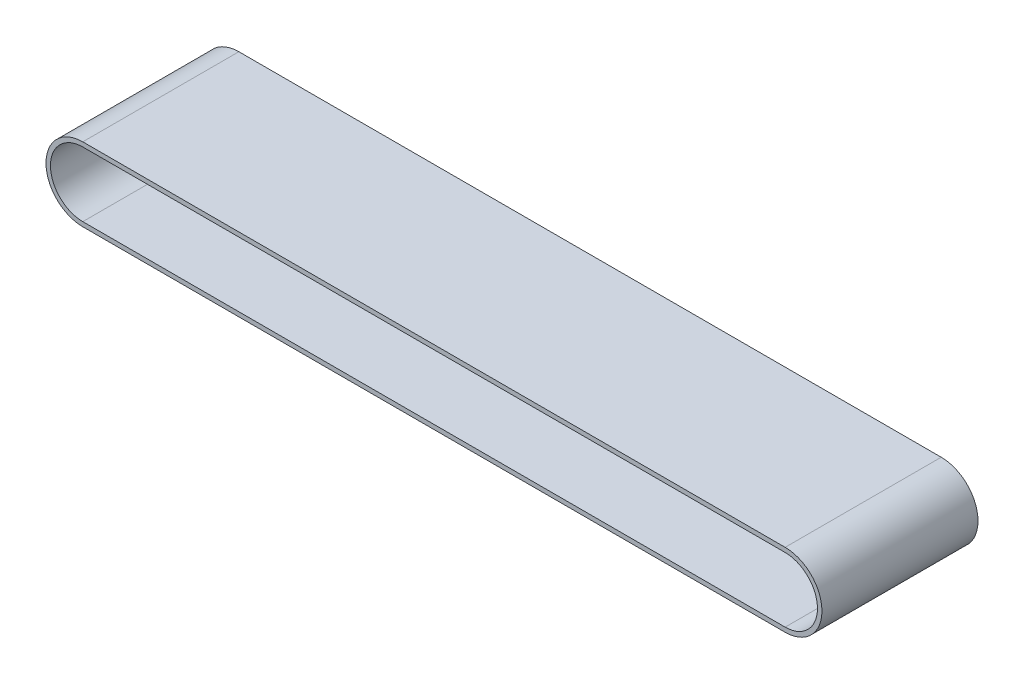
ISO-10303-21;
HEADER;
FILE_DESCRIPTION(('STEP AP214'),'2;1');
FILE_NAME('part.step','',(''),(''),'','','');
FILE_SCHEMA(('AUTOMOTIVE_DESIGN { 1 0 10303 214 1 1 1 1 }'));
ENDSEC;
DATA;
#1=APPLICATION_CONTEXT('core data for automotive mechanical design processes');
#2=APPLICATION_PROTOCOL_DEFINITION('international standard','automotive_design',2000,#1);
#3=PRODUCT_CONTEXT('',#1,'mechanical');
#4=PRODUCT('Part','Part','',(#3));
#5=PRODUCT_RELATED_PRODUCT_CATEGORY('part','',(#4));
#6=PRODUCT_DEFINITION_FORMATION('','',#4);
#7=PRODUCT_DEFINITION_CONTEXT('part definition',#1,'design');
#8=PRODUCT_DEFINITION('design','',#6,#7);
#9=PRODUCT_DEFINITION_SHAPE('','',#8);
#10=(LENGTH_UNIT() NAMED_UNIT(*) SI_UNIT(.MILLI.,.METRE.));
#11=(NAMED_UNIT(*) PLANE_ANGLE_UNIT() SI_UNIT($,.RADIAN.));
#12=(NAMED_UNIT(*) SI_UNIT($,.STERADIAN.) SOLID_ANGLE_UNIT());
#13=UNCERTAINTY_MEASURE_WITH_UNIT(LENGTH_MEASURE(1.E-05),#10,'distance_accuracy_value','');
#14=(GEOMETRIC_REPRESENTATION_CONTEXT(3) GLOBAL_UNCERTAINTY_ASSIGNED_CONTEXT((#13)) GLOBAL_UNIT_ASSIGNED_CONTEXT((#10,
#11,#12)) REPRESENTATION_CONTEXT('',''));
#15=CARTESIAN_POINT('',(0.,0.,0.));
#16=DIRECTION('',(0.,0.,1.));
#17=DIRECTION('',(1.,0.,0.));
#18=AXIS2_PLACEMENT_3D('',#15,#16,#17);
#19=CARTESIAN_POINT('',(-315.000000000001,-12.4999999999125,35.));
#20=DIRECTION('',(0.,-1.,0.));
#21=DIRECTION('',(0.,0.,-1.));
#22=AXIS2_PLACEMENT_3D('',#19,#20,#21);
#23=PLANE('',#22);
#24=DIRECTION('',(-1.,0.,0.));
#25=VECTOR('',#24,1.);
#26=CARTESIAN_POINT('',(-315.000000000001,-12.4999999999125,-35.));
#27=LINE('',#26,#25);
#28=CARTESIAN_POINT('',(-5.79488284573101E-12,-12.4999999999125,-35.));
#29=VERTEX_POINT('',#28);
#30=CARTESIAN_POINT('',(-315.000000000004,-12.4999999999125,-35.));
#31=VERTEX_POINT('',#30);
#32=EDGE_CURVE('E165',#29,#31,#27,.T.);
#33=ORIENTED_EDGE('',*,*,#32,.F.);
#34=DIRECTION('',(0.,0.,-1.));
#35=VECTOR('',#34,1.);
#36=CARTESIAN_POINT('',(-5.79488284573101E-12,-12.4999999999125,35.));
#37=LINE('',#36,#35);
#38=CARTESIAN_POINT('',(-5.79488284573101E-12,-12.4999999999125,35.));
#39=VERTEX_POINT('',#38);
#40=EDGE_CURVE('E12',#39,#29,#37,.T.);
#41=ORIENTED_EDGE('',*,*,#40,.F.);
#42=DIRECTION('',(-1.,0.,0.));
#43=VECTOR('',#42,1.);
#44=CARTESIAN_POINT('',(-315.000000000001,-12.4999999999125,35.));
#45=LINE('',#44,#43);
#46=CARTESIAN_POINT('',(-315.000000000004,-12.4999999999125,35.));
#47=VERTEX_POINT('',#46);
#48=EDGE_CURVE('E169',#39,#47,#45,.T.);
#49=ORIENTED_EDGE('',*,*,#48,.T.);
#50=DIRECTION('',(0.,0.,-1.));
#51=VECTOR('',#50,1.);
#52=CARTESIAN_POINT('',(-315.000000000004,-12.4999999999125,35.));
#53=LINE('',#52,#51);
#54=EDGE_CURVE('E70',#47,#31,#53,.T.);
#55=ORIENTED_EDGE('',*,*,#54,.T.);
#56=EDGE_LOOP('',(#33,#41,#49,#55));
#57=FACE_BOUND('',#56,.T.);
#58=ADVANCED_FACE('F67',(#57),#23,.T.);
#59=CARTESIAN_POINT('',(-2.44193168772197E-12,4.00000000008753,35.));
#60=DIRECTION('',(0.,0.,-1.));
#61=DIRECTION('',(-1.,0.,0.));
#62=AXIS2_PLACEMENT_3D('',#59,#60,#61);
#63=CYLINDRICAL_SURFACE('',#62,16.5);
#64=CARTESIAN_POINT('',(-2.44193168772197E-12,4.00000000008753,-35.));
#65=DIRECTION('',(0.,0.,-1.));
#66=DIRECTION('',(-1.,0.,0.));
#67=AXIS2_PLACEMENT_3D('',#64,#65,#66);
#68=CIRCLE('',#67,16.5);
#69=CARTESIAN_POINT('',(4.9960036108132E-13,20.5000000000875,-35.));
#70=VERTEX_POINT('',#69);
#71=EDGE_CURVE('E173',#70,#29,#68,.T.);
#72=ORIENTED_EDGE('',*,*,#71,.F.);
#73=DIRECTION('',(0.,0.,-1.));
#74=VECTOR('',#73,1.);
#75=CARTESIAN_POINT('',(4.9960036108132E-13,20.5000000000875,35.));
#76=LINE('',#75,#74);
#77=CARTESIAN_POINT('',(4.9960036108132E-13,20.5000000000875,35.));
#78=VERTEX_POINT('',#77);
#79=EDGE_CURVE('E75',#78,#70,#76,.T.);
#80=ORIENTED_EDGE('',*,*,#79,.F.);
#81=CARTESIAN_POINT('',(-2.44193168772197E-12,4.00000000008753,35.));
#82=DIRECTION('',(0.,0.,-1.));
#83=DIRECTION('',(-1.,0.,0.));
#84=AXIS2_PLACEMENT_3D('',#81,#82,#83);
#85=CIRCLE('',#84,16.5);
#86=EDGE_CURVE('E179',#78,#39,#85,.T.);
#87=ORIENTED_EDGE('',*,*,#86,.T.);
#88=ORIENTED_EDGE('',*,*,#40,.T.);
#89=EDGE_LOOP('',(#72,#80,#87,#88));
#90=FACE_BOUND('',#89,.T.);
#91=ADVANCED_FACE('F205',(#90),#63,.T.);
#92=CARTESIAN_POINT('',(-315.000000000001,20.5000000000875,35.));
#93=DIRECTION('',(0.,1.,0.));
#94=DIRECTION('',(0.,0.,1.));
#95=AXIS2_PLACEMENT_3D('',#92,#93,#94);
#96=PLANE('',#95);
#97=DIRECTION('',(1.,0.,0.));
#98=VECTOR('',#97,1.);
#99=CARTESIAN_POINT('',(-315.000000000001,20.5000000000875,-35.));
#100=LINE('',#99,#98);
#101=CARTESIAN_POINT('',(-314.999999999997,20.5000000000875,-35.));
#102=VERTEX_POINT('',#101);
#103=EDGE_CURVE('E187',#102,#70,#100,.T.);
#104=ORIENTED_EDGE('',*,*,#103,.F.);
#105=DIRECTION('',(0.,0.,-1.));
#106=VECTOR('',#105,1.);
#107=CARTESIAN_POINT('',(-314.999999999997,20.5000000000875,35.));
#108=LINE('',#107,#106);
#109=CARTESIAN_POINT('',(-314.999999999997,20.5000000000875,35.));
#110=VERTEX_POINT('',#109);
#111=EDGE_CURVE('E192',#110,#102,#108,.T.);
#112=ORIENTED_EDGE('',*,*,#111,.F.);
#113=DIRECTION('',(1.,0.,0.));
#114=VECTOR('',#113,1.);
#115=CARTESIAN_POINT('',(-315.000000000001,20.5000000000875,35.));
#116=LINE('',#115,#114);
#117=EDGE_CURVE('E176',#110,#78,#116,.T.);
#118=ORIENTED_EDGE('',*,*,#117,.T.);
#119=ORIENTED_EDGE('',*,*,#79,.T.);
#120=EDGE_LOOP('',(#104,#112,#118,#119));
#121=FACE_BOUND('',#120,.T.);
#122=ADVANCED_FACE('F209',(#121),#96,.T.);
#123=CARTESIAN_POINT('',(-315.000000000001,4.00000000008753,35.));
#124=DIRECTION('',(0.,0.,-1.));
#125=DIRECTION('',(-1.,0.,0.));
#126=AXIS2_PLACEMENT_3D('',#123,#124,#125);
#127=CYLINDRICAL_SURFACE('',#126,16.5);
#128=CARTESIAN_POINT('',(-315.000000000001,4.00000000008753,-35.));
#129=DIRECTION('',(0.,0.,-1.));
#130=DIRECTION('',(-1.,0.,0.));
#131=AXIS2_PLACEMENT_3D('',#128,#129,#130);
#132=CIRCLE('',#131,16.5);
#133=EDGE_CURVE('E184',#31,#102,#132,.T.);
#134=ORIENTED_EDGE('',*,*,#133,.F.);
#135=ORIENTED_EDGE('',*,*,#54,.F.);
#136=CARTESIAN_POINT('',(-315.000000000001,4.00000000008753,35.));
#137=DIRECTION('',(0.,0.,-1.));
#138=DIRECTION('',(-1.,0.,0.));
#139=AXIS2_PLACEMENT_3D('',#136,#137,#138);
#140=CIRCLE('',#139,16.5);
#141=EDGE_CURVE('E172',#47,#110,#140,.T.);
#142=ORIENTED_EDGE('',*,*,#141,.T.);
#143=ORIENTED_EDGE('',*,*,#111,.T.);
#144=EDGE_LOOP('',(#134,#135,#142,#143));
#145=FACE_BOUND('',#144,.T.);
#146=ADVANCED_FACE('F200',(#145),#127,.T.);
#147=CARTESIAN_POINT('',(-315.000000000001,4.00000000008753,35.));
#148=DIRECTION('',(0.,0.,-1.));
#149=DIRECTION('',(-1.,0.,0.));
#150=AXIS2_PLACEMENT_3D('',#147,#148,#149);
#151=PLANE('',#150);
#152=CARTESIAN_POINT('',(-2.44193168772197E-12,4.00000000008753,35.));
#153=DIRECTION('',(0.,0.,-1.));
#154=DIRECTION('',(-1.,0.,0.));
#155=AXIS2_PLACEMENT_3D('',#152,#153,#154);
#156=CIRCLE('',#155,14.5);
#157=CARTESIAN_POINT('',(5.08293253166508E-13,18.5000000000875,35.));
#158=VERTEX_POINT('',#157);
#159=CARTESIAN_POINT('',(-5.3884645235481E-12,-10.4999999999125,35.));
#160=VERTEX_POINT('',#159);
#161=EDGE_CURVE('E140',#158,#160,#156,.T.);
#162=ORIENTED_EDGE('',*,*,#161,.T.);
#163=DIRECTION('',(-1.,0.,0.));
#164=VECTOR('',#163,1.);
#165=CARTESIAN_POINT('',(-5.39215662861046E-12,-10.4999999999125,35.));
#166=LINE('',#165,#164);
#167=CARTESIAN_POINT('',(-315.000000000004,-10.4999999999125,35.));
#168=VERTEX_POINT('',#167);
#169=EDGE_CURVE('E134',#160,#168,#166,.T.);
#170=ORIENTED_EDGE('',*,*,#169,.T.);
#171=CARTESIAN_POINT('',(-315.000000000001,4.00000000008753,35.));
#172=DIRECTION('',(0.,0.,-1.));
#173=DIRECTION('',(-1.,0.,0.));
#174=AXIS2_PLACEMENT_3D('',#171,#172,#173);
#175=CIRCLE('',#174,14.5);
#176=CARTESIAN_POINT('',(-314.999999999998,18.5000000000875,35.));
#177=VERTEX_POINT('',#176);
#178=EDGE_CURVE('E143',#168,#177,#175,.T.);
#179=ORIENTED_EDGE('',*,*,#178,.T.);
#180=DIRECTION('',(1.,0.,0.));
#181=VECTOR('',#180,1.);
#182=CARTESIAN_POINT('',(-314.999999999998,18.5000000000875,35.));
#183=LINE('',#182,#181);
#184=EDGE_CURVE('E83',#177,#158,#183,.T.);
#185=ORIENTED_EDGE('',*,*,#184,.T.);
#186=EDGE_LOOP('',(#162,#170,#179,#185));
#187=FACE_BOUND('',#186,.T.);
#188=ORIENTED_EDGE('',*,*,#48,.F.);
#189=ORIENTED_EDGE('',*,*,#86,.F.);
#190=ORIENTED_EDGE('',*,*,#117,.F.);
#191=ORIENTED_EDGE('',*,*,#141,.F.);
#192=EDGE_LOOP('',(#188,#189,#190,#191));
#193=FACE_BOUND('',#192,.T.);
#194=ADVANCED_FACE('F147',(#187,#193),#151,.F.);
#195=CARTESIAN_POINT('',(-315.000000000001,4.00000000008753,-35.));
#196=DIRECTION('',(0.,0.,-1.));
#197=DIRECTION('',(-1.,0.,0.));
#198=AXIS2_PLACEMENT_3D('',#195,#196,#197);
#199=PLANE('',#198);
#200=DIRECTION('',(-1.,0.,0.));
#201=VECTOR('',#200,1.);
#202=CARTESIAN_POINT('',(-5.39215662861046E-12,-10.4999999999125,-35.));
#203=LINE('',#202,#201);
#204=CARTESIAN_POINT('',(-5.3884645235481E-12,-10.4999999999125,-35.));
#205=VERTEX_POINT('',#204);
#206=CARTESIAN_POINT('',(-315.000000000004,-10.4999999999125,-35.));
#207=VERTEX_POINT('',#206);
#208=EDGE_CURVE('E91',#205,#207,#203,.T.);
#209=ORIENTED_EDGE('',*,*,#208,.F.);
#210=CARTESIAN_POINT('',(-2.44193168772197E-12,4.00000000008753,-35.));
#211=DIRECTION('',(0.,0.,-1.));
#212=DIRECTION('',(-1.,0.,0.));
#213=AXIS2_PLACEMENT_3D('',#210,#211,#212);
#214=CIRCLE('',#213,14.5);
#215=CARTESIAN_POINT('',(5.08293253166508E-13,18.5000000000875,-35.));
#216=VERTEX_POINT('',#215);
#217=EDGE_CURVE('E150',#216,#205,#214,.T.);
#218=ORIENTED_EDGE('',*,*,#217,.F.);
#219=DIRECTION('',(1.,0.,0.));
#220=VECTOR('',#219,1.);
#221=CARTESIAN_POINT('',(-314.999999999998,18.5000000000875,-35.));
#222=LINE('',#221,#220);
#223=CARTESIAN_POINT('',(-314.999999999998,18.5000000000875,-35.));
#224=VERTEX_POINT('',#223);
#225=EDGE_CURVE('E153',#224,#216,#222,.T.);
#226=ORIENTED_EDGE('',*,*,#225,.F.);
#227=CARTESIAN_POINT('',(-315.000000000001,4.00000000008753,-35.));
#228=DIRECTION('',(0.,0.,-1.));
#229=DIRECTION('',(-1.,0.,0.));
#230=AXIS2_PLACEMENT_3D('',#227,#228,#229);
#231=CIRCLE('',#230,14.5);
#232=EDGE_CURVE('E159',#207,#224,#231,.T.);
#233=ORIENTED_EDGE('',*,*,#232,.F.);
#234=EDGE_LOOP('',(#209,#218,#226,#233));
#235=FACE_BOUND('',#234,.T.);
#236=ORIENTED_EDGE('',*,*,#32,.T.);
#237=ORIENTED_EDGE('',*,*,#133,.T.);
#238=ORIENTED_EDGE('',*,*,#103,.T.);
#239=ORIENTED_EDGE('',*,*,#71,.T.);
#240=EDGE_LOOP('',(#236,#237,#238,#239));
#241=FACE_BOUND('',#240,.T.);
#242=ADVANCED_FACE('F202',(#235,#241),#199,.T.);
#243=CARTESIAN_POINT('',(-5.39215662861046E-12,-10.4999999999125,35.));
#244=DIRECTION('',(0.,-1.,0.));
#245=DIRECTION('',(0.,0.,-1.));
#246=AXIS2_PLACEMENT_3D('',#243,#244,#245);
#247=PLANE('',#246);
#248=ORIENTED_EDGE('',*,*,#208,.T.);
#249=DIRECTION('',(0.,0.,-1.));
#250=VECTOR('',#249,1.);
#251=CARTESIAN_POINT('',(-315.000000000004,-10.4999999999125,35.));
#252=LINE('',#251,#250);
#253=EDGE_CURVE('E130',#168,#207,#252,.T.);
#254=ORIENTED_EDGE('',*,*,#253,.F.);
#255=ORIENTED_EDGE('',*,*,#169,.F.);
#256=DIRECTION('',(0.,0.,-1.));
#257=VECTOR('',#256,1.);
#258=CARTESIAN_POINT('',(-5.3884645235481E-12,-10.4999999999125,35.));
#259=LINE('',#258,#257);
#260=EDGE_CURVE('E163',#160,#205,#259,.T.);
#261=ORIENTED_EDGE('',*,*,#260,.T.);
#262=EDGE_LOOP('',(#248,#254,#255,#261));
#263=FACE_BOUND('',#262,.T.);
#264=ADVANCED_FACE('F132',(#263),#247,.F.);
#265=CARTESIAN_POINT('',(-2.44193168772197E-12,4.00000000008753,35.));
#266=DIRECTION('',(0.,0.,-1.));
#267=DIRECTION('',(-1.,0.,0.));
#268=AXIS2_PLACEMENT_3D('',#265,#266,#267);
#269=CYLINDRICAL_SURFACE('',#268,14.5);
#270=ORIENTED_EDGE('',*,*,#217,.T.);
#271=ORIENTED_EDGE('',*,*,#260,.F.);
#272=ORIENTED_EDGE('',*,*,#161,.F.);
#273=DIRECTION('',(0.,0.,-1.));
#274=VECTOR('',#273,1.);
#275=CARTESIAN_POINT('',(5.08293253166508E-13,18.5000000000875,35.));
#276=LINE('',#275,#274);
#277=EDGE_CURVE('E166',#158,#216,#276,.T.);
#278=ORIENTED_EDGE('',*,*,#277,.T.);
#279=EDGE_LOOP('',(#270,#271,#272,#278));
#280=FACE_BOUND('',#279,.T.);
#281=ADVANCED_FACE('F260',(#280),#269,.F.);
#282=CARTESIAN_POINT('',(-314.999999999998,18.5000000000875,35.));
#283=DIRECTION('',(0.,1.,0.));
#284=DIRECTION('',(0.,0.,1.));
#285=AXIS2_PLACEMENT_3D('',#282,#283,#284);
#286=PLANE('',#285);
#287=ORIENTED_EDGE('',*,*,#225,.T.);
#288=ORIENTED_EDGE('',*,*,#277,.F.);
#289=ORIENTED_EDGE('',*,*,#184,.F.);
#290=DIRECTION('',(0.,0.,-1.));
#291=VECTOR('',#290,1.);
#292=CARTESIAN_POINT('',(-314.999999999998,18.5000000000875,35.));
#293=LINE('',#292,#291);
#294=EDGE_CURVE('E139',#177,#224,#293,.T.);
#295=ORIENTED_EDGE('',*,*,#294,.T.);
#296=EDGE_LOOP('',(#287,#288,#289,#295));
#297=FACE_BOUND('',#296,.T.);
#298=ADVANCED_FACE('F269',(#297),#286,.F.);
#299=CARTESIAN_POINT('',(-315.000000000001,4.00000000008753,35.));
#300=DIRECTION('',(0.,0.,-1.));
#301=DIRECTION('',(-1.,0.,0.));
#302=AXIS2_PLACEMENT_3D('',#299,#300,#301);
#303=CYLINDRICAL_SURFACE('',#302,14.5);
#304=ORIENTED_EDGE('',*,*,#232,.T.);
#305=ORIENTED_EDGE('',*,*,#294,.F.);
#306=ORIENTED_EDGE('',*,*,#178,.F.);
#307=ORIENTED_EDGE('',*,*,#253,.T.);
#308=EDGE_LOOP('',(#304,#305,#306,#307));
#309=FACE_BOUND('',#308,.T.);
#310=ADVANCED_FACE('F144',(#309),#303,.F.);
#311=CLOSED_SHELL('',(#58,#91,#122,#146,#194,#242,#264,#281,#298,#310));
#312=MANIFOLD_SOLID_BREP('B2',#311);
#313=ADVANCED_BREP_SHAPE_REPRESENTATION('',(#18,#312),#14);
#314=SHAPE_DEFINITION_REPRESENTATION(#9,#313);
ENDSEC;
END-ISO-10303-21;
